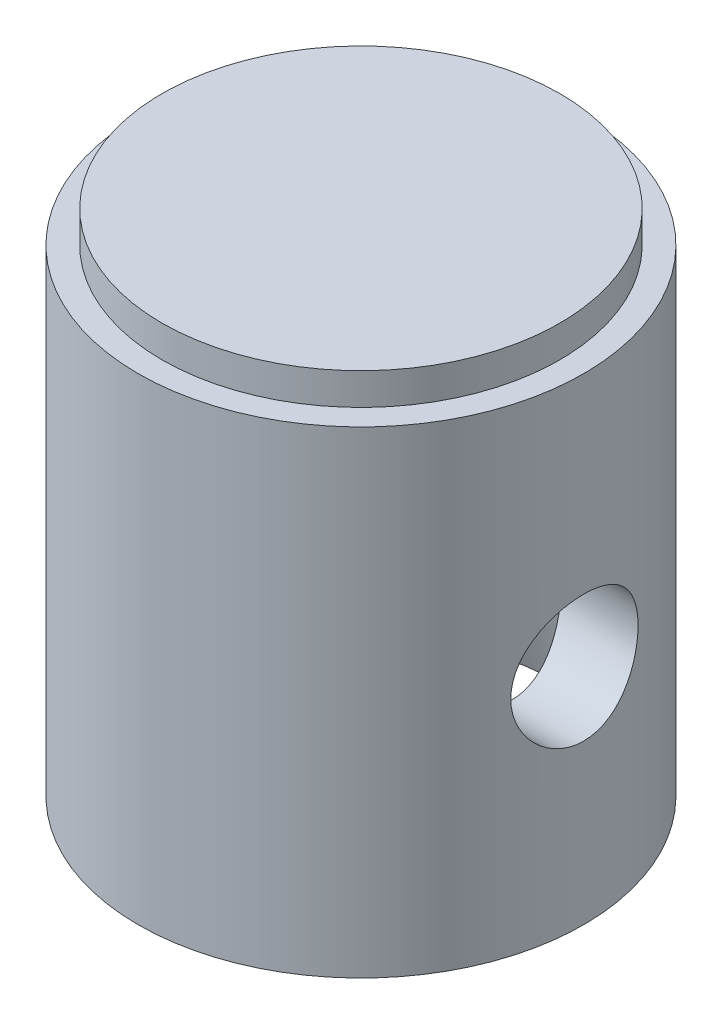
ISO-10303-21;
HEADER;
FILE_DESCRIPTION(('STEP AP214'),'2;1');
FILE_NAME('part.step','',(''),(''),'','','');
FILE_SCHEMA(('AUTOMOTIVE_DESIGN { 1 0 10303 214 1 1 1 1 }'));
ENDSEC;
DATA;
#1=APPLICATION_CONTEXT('core data for automotive mechanical design processes');
#2=APPLICATION_PROTOCOL_DEFINITION('international standard','automotive_design',2000,#1);
#3=PRODUCT_CONTEXT('',#1,'mechanical');
#4=PRODUCT('Part','Part','',(#3));
#5=PRODUCT_RELATED_PRODUCT_CATEGORY('part','',(#4));
#6=PRODUCT_DEFINITION_FORMATION('','',#4);
#7=PRODUCT_DEFINITION_CONTEXT('part definition',#1,'design');
#8=PRODUCT_DEFINITION('design','',#6,#7);
#9=PRODUCT_DEFINITION_SHAPE('','',#8);
#10=(LENGTH_UNIT() NAMED_UNIT(*) SI_UNIT(.MILLI.,.METRE.));
#11=(NAMED_UNIT(*) PLANE_ANGLE_UNIT() SI_UNIT($,.RADIAN.));
#12=(NAMED_UNIT(*) SI_UNIT($,.STERADIAN.) SOLID_ANGLE_UNIT());
#13=UNCERTAINTY_MEASURE_WITH_UNIT(LENGTH_MEASURE(1.E-05),#10,'distance_accuracy_value','');
#14=(GEOMETRIC_REPRESENTATION_CONTEXT(3) GLOBAL_UNCERTAINTY_ASSIGNED_CONTEXT((#13)) GLOBAL_UNIT_ASSIGNED_CONTEXT((#10,
#11,#12)) REPRESENTATION_CONTEXT('',''));
#15=CARTESIAN_POINT('',(0.,0.,0.));
#16=DIRECTION('',(0.,0.,1.));
#17=DIRECTION('',(1.,0.,0.));
#18=AXIS2_PLACEMENT_3D('',#15,#16,#17);
#19=CARTESIAN_POINT('',(6.25,9.55576170218685,0.));
#20=DIRECTION('',(0.,-1.,0.));
#21=DIRECTION('',(0.,0.,-1.));
#22=AXIS2_PLACEMENT_3D('',#19,#20,#21);
#23=PLANE('',#22);
#24=CARTESIAN_POINT('',(0.,9.55576170218685,0.));
#25=DIRECTION('',(0.,1.,0.));
#26=DIRECTION('',(0.,0.,1.));
#27=AXIS2_PLACEMENT_3D('',#24,#25,#26);
#28=CIRCLE('',#27,6.25);
#29=CARTESIAN_POINT('',(0.,9.55576170218685,6.25));
#30=VERTEX_POINT('',#29);
#31=EDGE_CURVE('E85',#30,#30,#28,.T.);
#32=ORIENTED_EDGE('',*,*,#31,.T.);
#33=EDGE_LOOP('',(#32));
#34=FACE_BOUND('',#33,.T.);
#35=ADVANCED_FACE('F41',(#34),#23,.F.);
#36=CARTESIAN_POINT('',(0.,7.40984964256775,0.));
#37=DIRECTION('',(0.,-1.,0.));
#38=DIRECTION('',(0.,0.,-1.));
#39=AXIS2_PLACEMENT_3D('',#36,#37,#38);
#40=CONICAL_SURFACE('',#39,0.,1.02974425867666);
#41=CARTESIAN_POINT('',(0.,4.55576170218685,0.));
#42=DIRECTION('',(0.,1.,0.));
#43=DIRECTION('',(0.,0.,1.));
#44=AXIS2_PLACEMENT_3D('',#41,#42,#43);
#45=CIRCLE('',#44,4.75);
#46=CARTESIAN_POINT('',(0.,4.55576170218685,4.75));
#47=VERTEX_POINT('',#46);
#48=EDGE_CURVE('E103',#47,#47,#45,.T.);
#49=ORIENTED_EDGE('',*,*,#48,.F.);
#50=EDGE_LOOP('',(#49));
#51=FACE_BOUND('',#50,.T.);
#52=CARTESIAN_POINT('',(0.,7.40984964256775,0.));
#53=VERTEX_POINT('',#52);
#54=VERTEX_LOOP('',#53);
#55=FACE_BOUND('',#54,.T.);
#56=ADVANCED_FACE('F55',(#51,#55),#40,.F.);
#57=CARTESIAN_POINT('',(0.,8.10891089108911,0.));
#58=DIRECTION('',(0.,1.,0.));
#59=DIRECTION('',(0.,0.,1.));
#60=AXIS2_PLACEMENT_3D('',#57,#58,#59);
#61=CYLINDRICAL_SURFACE('',#60,4.75);
#62=CARTESIAN_POINT('',(-4.30842198490352,0.555761702186853,-2.));
#63=CARTESIAN_POINT('',(-4.30843054464486,0.449194189419275,-1.99999131934848));
#64=CARTESIAN_POINT('',(-4.31243212963685,0.342471289222361,-1.99143079107255));
#65=CARTESIAN_POINT('',(-4.32792093407999,0.132105158718151,-1.9575309488105));
#66=CARTESIAN_POINT('',(-4.33942828076367,0.0284709946892458,-1.93214651737775));
#67=CARTESIAN_POINT('',(-4.36837651337227,-0.172281978748336,-1.86576551208753));
#68=CARTESIAN_POINT('',(-4.38579283230239,-0.269425802291525,-1.8248334955727));
#69=CARTESIAN_POINT('',(-4.42456063901514,-0.455440802484032,-1.72871004996954));
#70=CARTESIAN_POINT('',(-4.44591125359938,-0.54431380822792,-1.67352178389854));
#71=CARTESIAN_POINT('',(-4.49165970324772,-0.716966437794243,-1.5467015963202));
#72=CARTESIAN_POINT('',(-4.51616225633892,-0.80015692528574,-1.47430503116527));
#73=CARTESIAN_POINT('',(-4.56459392696584,-0.953652612186102,-1.31672831441459));
#74=CARTESIAN_POINT('',(-4.58852281750948,-1.02395278186696,-1.23154319627829));
#75=CARTESIAN_POINT('',(-4.63438842840327,-1.15269948454706,-1.04615829588292));
#76=CARTESIAN_POINT('',(-4.65618928890282,-1.21048009615943,-0.945459368167892));
#77=CARTESIAN_POINT('',(-4.69405721652876,-1.30802538390718,-0.734686551915895));
#78=CARTESIAN_POINT('',(-4.71012687932976,-1.34779821801796,-0.624616935439679));
#79=CARTESIAN_POINT('',(-4.73397861503267,-1.40605425558268,-0.404415522796753));
#80=CARTESIAN_POINT('',(-4.74215483370298,-1.42555419955888,-0.294596284647781));
#81=CARTESIAN_POINT('',(-4.75073207786679,-1.44599933609554,-0.0729606495985198));
#82=CARTESIAN_POINT('',(-4.75113632780298,-1.44695222348068,0.0388548997969275));
#83=CARTESIAN_POINT('',(-4.74435401811761,-1.43080228994989,0.25390450753408));
#84=CARTESIAN_POINT('',(-4.73763746002986,-1.41481746107326,0.357240149333749));
#85=CARTESIAN_POINT('',(-4.71801685316286,-1.36716635676943,0.559603082118503));
#86=CARTESIAN_POINT('',(-4.70511234778455,-1.33549892414149,0.658630054585297));
#87=CARTESIAN_POINT('',(-4.67411206487987,-1.257009360187,0.851387128927116));
#88=CARTESIAN_POINT('',(-4.65593996608066,-1.20996302454373,0.945013153905918));
#89=CARTESIAN_POINT('',(-4.61617592633721,-1.10227365607975,1.12328732884621));
#90=CARTESIAN_POINT('',(-4.59458276960119,-1.04162578628504,1.20793226914312));
#91=CARTESIAN_POINT('',(-4.54830782988722,-0.903395985404505,1.37229770971299));
#92=CARTESIAN_POINT('',(-4.52351560106454,-0.82491112100109,1.45122884715761));
#93=CARTESIAN_POINT('',(-4.47479248215149,-0.655774638638896,1.59515452572047));
#94=CARTESIAN_POINT('',(-4.45086194184458,-0.565118148938156,1.66014345921645));
#95=CARTESIAN_POINT('',(-4.40577320225433,-0.37030615172039,1.7764273686949));
#96=CARTESIAN_POINT('',(-4.38473764193727,-0.265795286896516,1.82717867740344));
#97=CARTESIAN_POINT('',(-4.34928865313087,-0.0485899285548528,1.91003748440372));
#98=CARTESIAN_POINT('',(-4.33487037464152,0.0640985010030139,1.94215864184886));
#99=CARTESIAN_POINT('',(-4.31549852286991,0.286544098545186,1.98481471902991));
#100=CARTESIAN_POINT('',(-4.30998424080262,0.396005681354565,1.9966317594255));
#101=CARTESIAN_POINT('',(-4.30744060160681,0.615463104487311,2.00211667986055));
#102=CARTESIAN_POINT('',(-4.31040820403393,0.725458739261143,1.99579106337395));
#103=CARTESIAN_POINT('',(-4.32391366279905,0.935209863626901,1.96634091191023));
#104=CARTESIAN_POINT('',(-4.33393906571426,1.03516212102973,1.9443524158464));
#105=CARTESIAN_POINT('',(-4.35977052749396,1.22987178862912,1.88571462232035));
#106=CARTESIAN_POINT('',(-4.37557795658566,1.32462796132941,1.84906184951785));
#107=CARTESIAN_POINT('',(-4.41201518341638,1.51078900054006,1.76039932389396));
#108=CARTESIAN_POINT('',(-4.43282235903574,1.60187706049728,1.70779965559225));
#109=CARTESIAN_POINT('',(-4.47666738500819,1.77437756660037,1.589319161925));
#110=CARTESIAN_POINT('',(-4.49970621283597,1.85578573781476,1.52343250299735));
#111=CARTESIAN_POINT('',(-4.54773889674336,2.01368986465641,1.37376869985395));
#112=CARTESIAN_POINT('',(-4.57273542348659,2.08920862217041,1.2889572905915));
#113=CARTESIAN_POINT('',(-4.62008723507347,2.22512424152227,1.10729218870919));
#114=CARTESIAN_POINT('',(-4.64244230114524,2.28551985128908,1.01043749999861));
#115=CARTESIAN_POINT('',(-4.682159175267,2.38945591835673,0.806650096429425));
#116=CARTESIAN_POINT('',(-4.69950379318315,2.43293852220715,0.6996843189877));
#117=CARTESIAN_POINT('',(-4.72708719511963,2.50096864666081,0.479036335100372));
#118=CARTESIAN_POINT('',(-4.73733030731735,2.52552770167856,0.365358265548636));
#119=CARTESIAN_POINT('',(-4.74904919006876,2.55353872779214,0.143237353681145));
#120=CARTESIAN_POINT('',(-4.75109668232659,2.55836761025123,0.0349971697480149));
#121=CARTESIAN_POINT('',(-4.74778566283005,2.55050063868136,-0.180716748799997));
#122=CARTESIAN_POINT('',(-4.74242849849833,2.53780797304267,-0.288190619283815));
#123=CARTESIAN_POINT('',(-4.72521382558719,2.49624679177646,-0.495239451900787));
#124=CARTESIAN_POINT('',(-4.71360275973926,2.46799067474204,-0.594959548485699));
#125=CARTESIAN_POINT('',(-4.68516673707061,2.3967803969835,-0.788200583199375));
#126=CARTESIAN_POINT('',(-4.66834080086551,2.35382347520078,-0.881720352860748));
#127=CARTESIAN_POINT('',(-4.63014910919753,2.25225550678784,-1.064584614925));
#128=CARTESIAN_POINT('',(-4.6086119906344,2.19302255272573,-1.15354705854381));
#129=CARTESIAN_POINT('',(-4.56353829444643,2.0614836466712,-1.32065163159127));
#130=CARTESIAN_POINT('',(-4.54000095769205,1.98917271942986,-1.3987896230298));
#131=CARTESIAN_POINT('',(-4.49151263650841,1.82757953779019,-1.54769821595443));
#132=CARTESIAN_POINT('',(-4.46657752434327,1.73746546466663,-1.61757515170057));
#133=CARTESIAN_POINT('',(-4.41979333465504,1.546058640499,-1.74135517953708));
#134=CARTESIAN_POINT('',(-4.39794600935449,1.44475959994569,-1.79524922073293));
#135=CARTESIAN_POINT('',(-4.36022694521342,1.23379740033437,-1.88502336126085));
#136=CARTESIAN_POINT('',(-4.3443308421422,1.12417060456636,-1.92097711385374));
#137=CARTESIAN_POINT('',(-4.32660944209334,0.955991056566383,-1.9603932149606));
#138=CARTESIAN_POINT('',(-4.32172453578694,0.899364325330725,-1.9711094684443));
#139=CARTESIAN_POINT('',(-4.31415686352989,0.785262529818344,-1.98762169826053));
#140=CARTESIAN_POINT('',(-4.31147257065106,0.727788081978567,-1.99342108632849));
#141=CARTESIAN_POINT('',(-4.30892809699833,0.632080006528274,-1.99890914769187));
#142=CARTESIAN_POINT('',(-4.30841891907438,0.593930821266735,-2.00000310913535));
#143=CARTESIAN_POINT('',(-4.30842198490352,0.555761702186853,-2.));
#144=B_SPLINE_CURVE_WITH_KNOTS('',3,(#62,#63,#64,#65,#66,#67,#68,#69,#70,#71,#72,#73,#74,#75,
#76,#77,#78,#79,#80,#81,#82,#83,#84,#85,#86,#87,#88,#89,#90,#91,#92,#93,#94,#95,#96,#97,#98,#99,
#100,#101,#102,#103,#104,#105,#106,#107,#108,#109,#110,#111,#112,#113,#114,#115,#116,#117,#118,
#119,#120,#121,#122,#123,#124,#125,#126,#127,#128,#129,#130,#131,#132,#133,#134,#135,#136,#137,
#138,#139,#140,#141,#142,#143),.UNSPECIFIED.,.T.,.F.,(4,2,2,2,2,2,2,2,2,2,2,2,2,2,2,2,2,2,2,2,2,
2,2,2,2,2,2,2,2,2,2,2,2,2,2,2,2,2,2,2,4),(0.,0.3195673434676,0.639995172162606,
0.959106799139382,1.27814768591402,1.61558401305247,1.95315172701683,2.30572671230962,
2.65814181207011,2.99187659997614,3.32547292464746,3.63834534304787,3.95124085137407,
4.26891815696387,4.58670861451657,4.92730569009794,5.26803949971278,5.62041363560371,
5.97252909208191,6.30145873189971,6.63027047730072,6.9373851990156,7.24457274812027,
7.56490236261953,7.88537292302805,8.23259290369929,8.57984162180395,8.92826792359706,
9.27648168177332,9.59993054486148,9.92332055782565,10.2348109826313,10.5463599427188,
10.8720466326587,11.1978574851006,11.5463872959705,11.8951140992724,12.2423971882221,
12.4157051509404,12.5888927593436,12.703351694061),.UNSPECIFIED.);
#145=CARTESIAN_POINT('',(-4.30842198490352,0.555761702186853,-2.));
#146=VERTEX_POINT('',#145);
#147=EDGE_CURVE('E79',#146,#146,#144,.T.);
#148=ORIENTED_EDGE('',*,*,#147,.T.);
#149=EDGE_LOOP('',(#148));
#150=FACE_BOUND('',#149,.T.);
#151=CARTESIAN_POINT('',(4.30842198490352,0.555761702186853,-2.));
#152=CARTESIAN_POINT('',(4.30843054464486,0.662329214954431,-1.99999131934848));
#153=CARTESIAN_POINT('',(4.31243212963685,0.769052115151345,-1.99143079107255));
#154=CARTESIAN_POINT('',(4.32792093407999,0.979418245655555,-1.9575309488105));
#155=CARTESIAN_POINT('',(4.33942828076367,1.08305240968446,-1.93214651737775));
#156=CARTESIAN_POINT('',(4.36837651337227,1.28380538312204,-1.86576551208753));
#157=CARTESIAN_POINT('',(4.38579283230239,1.38094920666523,-1.8248334955727));
#158=CARTESIAN_POINT('',(4.42456063901514,1.56696420685774,-1.72871004996954));
#159=CARTESIAN_POINT('',(4.44591125359938,1.65583721260163,-1.67352178389854));
#160=CARTESIAN_POINT('',(4.49165970324772,1.82848984216795,-1.5467015963202));
#161=CARTESIAN_POINT('',(4.51616225633892,1.91168032965945,-1.47430503116527));
#162=CARTESIAN_POINT('',(4.56459392696584,2.06517601655981,-1.31672831441459));
#163=CARTESIAN_POINT('',(4.58852281750948,2.13547618624067,-1.23154319627829));
#164=CARTESIAN_POINT('',(4.63438842840327,2.26422288892077,-1.04615829588292));
#165=CARTESIAN_POINT('',(4.65618928890282,2.32200350053314,-0.945459368167892));
#166=CARTESIAN_POINT('',(4.69405721652876,2.41954878828088,-0.734686551915895));
#167=CARTESIAN_POINT('',(4.71012687932976,2.45932162239166,-0.624616935439679));
#168=CARTESIAN_POINT('',(4.73397861503267,2.51757765995639,-0.404415522796753));
#169=CARTESIAN_POINT('',(4.74215483370298,2.53707760393259,-0.294596284647781));
#170=CARTESIAN_POINT('',(4.75073207786679,2.55752274046924,-0.0729606495985197));
#171=CARTESIAN_POINT('',(4.75113632780298,2.55847562785439,0.0388548997969277));
#172=CARTESIAN_POINT('',(4.74435401811761,2.5423256943236,0.25390450753408));
#173=CARTESIAN_POINT('',(4.73763746002986,2.52634086544696,0.35724014933375));
#174=CARTESIAN_POINT('',(4.71801685316286,2.47868976114314,0.559603082118503));
#175=CARTESIAN_POINT('',(4.70511234778455,2.4470223285152,0.658630054585297));
#176=CARTESIAN_POINT('',(4.67411206487987,2.3685327645607,0.851387128927116));
#177=CARTESIAN_POINT('',(4.65593996608066,2.32148642891744,0.945013153905918));
#178=CARTESIAN_POINT('',(4.61617592633721,2.21379706045346,1.12328732884621));
#179=CARTESIAN_POINT('',(4.59458276960119,2.15314919065875,1.20793226914312));
#180=CARTESIAN_POINT('',(4.54830782988722,2.01491938977821,1.37229770971299));
#181=CARTESIAN_POINT('',(4.52351560106454,1.9364345253748,1.45122884715761));
#182=CARTESIAN_POINT('',(4.47479248215149,1.7672980430126,1.59515452572048));
#183=CARTESIAN_POINT('',(4.45086194184458,1.67664155331186,1.66014345921645));
#184=CARTESIAN_POINT('',(4.40577320225433,1.4818295560941,1.7764273686949));
#185=CARTESIAN_POINT('',(4.38473764193727,1.37731869127022,1.82717867740344));
#186=CARTESIAN_POINT('',(4.34928865313087,1.16011333292856,1.91003748440372));
#187=CARTESIAN_POINT('',(4.33487037464151,1.04742490337069,1.94215864184886));
#188=CARTESIAN_POINT('',(4.31549852286991,0.82497930582852,1.98481471902991));
#189=CARTESIAN_POINT('',(4.30998424080262,0.715517723019141,1.9966317594255));
#190=CARTESIAN_POINT('',(4.30744060160681,0.496060299886394,2.00211667986055));
#191=CARTESIAN_POINT('',(4.31040820403393,0.386064665112562,1.99579106337395));
#192=CARTESIAN_POINT('',(4.32391366279905,0.176313540746805,1.96634091191023));
#193=CARTESIAN_POINT('',(4.33393906571426,0.0763612833439732,1.9443524158464));
#194=CARTESIAN_POINT('',(4.35977052749396,-0.118348384255419,1.88571462232035));
#195=CARTESIAN_POINT('',(4.37557795658566,-0.213104556955705,1.84906184951785));
#196=CARTESIAN_POINT('',(4.41201518341638,-0.399265596166358,1.76039932389396));
#197=CARTESIAN_POINT('',(4.43282235903574,-0.49035365612357,1.70779965559225));
#198=CARTESIAN_POINT('',(4.47666738500819,-0.662854162226665,1.589319161925));
#199=CARTESIAN_POINT('',(4.49970621283597,-0.744262333441057,1.52343250299735));
#200=CARTESIAN_POINT('',(4.54773889674336,-0.902166460282703,1.37376869985395));
#201=CARTESIAN_POINT('',(4.57273542348659,-0.977685217796702,1.2889572905915));
#202=CARTESIAN_POINT('',(4.62008723507347,-1.11360083714857,1.10729218870919));
#203=CARTESIAN_POINT('',(4.64244230114524,-1.17399644691538,1.01043749999861));
#204=CARTESIAN_POINT('',(4.682159175267,-1.27793251398302,0.806650096429425));
#205=CARTESIAN_POINT('',(4.69950379318315,-1.32141511783345,0.699684318987699));
#206=CARTESIAN_POINT('',(4.72708719511963,-1.3894452422871,0.479036335100372));
#207=CARTESIAN_POINT('',(4.73733030731735,-1.41400429730485,0.365358265548636));
#208=CARTESIAN_POINT('',(4.74904919006876,-1.44201532341844,0.143237353681144));
#209=CARTESIAN_POINT('',(4.75109668232659,-1.44684420587753,0.0349971697480141));
#210=CARTESIAN_POINT('',(4.74778566283005,-1.43897723430765,-0.180716748799998));
#211=CARTESIAN_POINT('',(4.74242849849833,-1.42628456866896,-0.288190619283816));
#212=CARTESIAN_POINT('',(4.72521382558719,-1.38472338740275,-0.495239451900788));
#213=CARTESIAN_POINT('',(4.71360275973926,-1.35646727036833,-0.5949595484857));
#214=CARTESIAN_POINT('',(4.68516673707061,-1.28525699260979,-0.788200583199376));
#215=CARTESIAN_POINT('',(4.66834080086551,-1.24230007082708,-0.881720352860749));
#216=CARTESIAN_POINT('',(4.63014910919753,-1.14073210241413,-1.064584614925));
#217=CARTESIAN_POINT('',(4.6086119906344,-1.08149914835203,-1.15354705854381));
#218=CARTESIAN_POINT('',(4.56353829444643,-0.949960242297496,-1.32065163159127));
#219=CARTESIAN_POINT('',(4.54000095769205,-0.877649315056154,-1.3987896230298));
#220=CARTESIAN_POINT('',(4.49151263650841,-0.716056133416485,-1.54769821595443));
#221=CARTESIAN_POINT('',(4.46657752434327,-0.625942060292924,-1.61757515170057));
#222=CARTESIAN_POINT('',(4.41979333465504,-0.434535236125293,-1.74135517953708));
#223=CARTESIAN_POINT('',(4.39794600935449,-0.333236195571981,-1.79524922073293));
#224=CARTESIAN_POINT('',(4.36022694521342,-0.122273995960661,-1.88502336126085));
#225=CARTESIAN_POINT('',(4.3443308421422,-0.0126472001926526,-1.92097711385374));
#226=CARTESIAN_POINT('',(4.32660944209334,0.155532347807326,-1.9603932149606));
#227=CARTESIAN_POINT('',(4.32172453578694,0.212159079042984,-1.9711094684443));
#228=CARTESIAN_POINT('',(4.31415686352989,0.326260874555364,-1.98762169826053));
#229=CARTESIAN_POINT('',(4.31147257065106,0.383735322395142,-1.99342108632849));
#230=CARTESIAN_POINT('',(4.30892809699833,0.479443397845433,-1.99890914769187));
#231=CARTESIAN_POINT('',(4.30841891907438,0.517592583106971,-2.00000310913535));
#232=CARTESIAN_POINT('',(4.30842198490352,0.555761702186853,-2.));
#233=B_SPLINE_CURVE_WITH_KNOTS('',3,(#151,#152,#153,#154,#155,#156,#157,#158,#159,#160,#161,
#162,#163,#164,#165,#166,#167,#168,#169,#170,#171,#172,#173,#174,#175,#176,#177,#178,#179,#180,
#181,#182,#183,#184,#185,#186,#187,#188,#189,#190,#191,#192,#193,#194,#195,#196,#197,#198,#199,
#200,#201,#202,#203,#204,#205,#206,#207,#208,#209,#210,#211,#212,#213,#214,#215,#216,#217,#218,
#219,#220,#221,#222,#223,#224,#225,#226,#227,#228,#229,#230,#231,#232),.UNSPECIFIED.,.T.,.F.,(4,
2,2,2,2,2,2,2,2,2,2,2,2,2,2,2,2,2,2,2,2,2,2,2,2,2,2,2,2,2,2,2,2,2,2,2,2,2,2,2,4),(0.,
0.3195673434676,0.639995172162606,0.959106799139383,1.27814768591402,1.61558401305247,
1.95315172701683,2.30572671230962,2.65814181207011,2.99187659997614,3.32547292464746,
3.63834534304787,3.95124085137407,4.26891815696387,4.58670861451657,4.92730569009794,
5.26803949971278,5.62041363560371,5.97252909208191,6.30145873189971,6.63027047730072,
6.9373851990156,7.24457274812027,7.56490236261953,7.88537292302805,8.23259290369929,
8.57984162180395,8.92826792359706,9.27648168177332,9.59993054486148,9.92332055782565,
10.2348109826313,10.5463599427188,10.8720466326587,11.1978574851006,11.5463872959705,
11.8951140992724,12.2423971882221,12.4157051509404,12.5888927593436,12.703351694061),.UNSPECIFIED.);
#234=CARTESIAN_POINT('',(4.30842198490352,0.555761702186853,-2.));
#235=VERTEX_POINT('',#234);
#236=EDGE_CURVE('E74',#235,#235,#233,.T.);
#237=ORIENTED_EDGE('',*,*,#236,.T.);
#238=EDGE_LOOP('',(#237));
#239=FACE_BOUND('',#238,.T.);
#240=CARTESIAN_POINT('',(0.,-2.46039603960396,0.));
#241=DIRECTION('',(0.,1.,0.));
#242=DIRECTION('',(0.,0.,1.));
#243=AXIS2_PLACEMENT_3D('',#240,#241,#242);
#244=CIRCLE('',#243,4.75);
#245=CARTESIAN_POINT('',(0.,-2.46039603960396,4.75));
#246=VERTEX_POINT('',#245);
#247=EDGE_CURVE('E125',#246,#246,#244,.T.);
#248=ORIENTED_EDGE('',*,*,#247,.F.);
#249=EDGE_LOOP('',(#248));
#250=FACE_BOUND('',#249,.T.);
#251=ORIENTED_EDGE('',*,*,#48,.T.);
#252=EDGE_LOOP('',(#251));
#253=FACE_BOUND('',#252,.T.);
#254=ADVANCED_FACE('F57',(#150,#239,#250,#253),#61,.F.);
#255=CARTESIAN_POINT('',(0.,-2.46039603960396,0.));
#256=DIRECTION('',(0.,-1.,0.));
#257=DIRECTION('',(0.,0.,-1.));
#258=AXIS2_PLACEMENT_3D('',#255,#256,#257);
#259=CONICAL_SURFACE('',#258,4.75,0.349065850398868);
#260=CARTESIAN_POINT('',(0.,-6.44423829781315,0.));
#261=DIRECTION('',(0.,1.,0.));
#262=DIRECTION('',(0.,0.,1.));
#263=AXIS2_PLACEMENT_3D('',#260,#261,#262);
#264=CIRCLE('',#263,6.2);
#265=CARTESIAN_POINT('',(0.,-6.44423829781315,6.2));
#266=VERTEX_POINT('',#265);
#267=EDGE_CURVE('E124',#266,#266,#264,.T.);
#268=ORIENTED_EDGE('',*,*,#267,.F.);
#269=EDGE_LOOP('',(#268));
#270=FACE_BOUND('',#269,.T.);
#271=ORIENTED_EDGE('',*,*,#247,.T.);
#272=EDGE_LOOP('',(#271));
#273=FACE_BOUND('',#272,.T.);
#274=ADVANCED_FACE('F64',(#270,#273),#259,.F.);
#275=CARTESIAN_POINT('',(6.2,-6.44423829781315,0.));
#276=DIRECTION('',(0.,1.,0.));
#277=DIRECTION('',(0.,0.,1.));
#278=AXIS2_PLACEMENT_3D('',#275,#276,#277);
#279=PLANE('',#278);
#280=CARTESIAN_POINT('',(0.,-6.44423829781315,0.));
#281=DIRECTION('',(0.,1.,0.));
#282=DIRECTION('',(0.,0.,1.));
#283=AXIS2_PLACEMENT_3D('',#280,#281,#282);
#284=CIRCLE('',#283,7.);
#285=CARTESIAN_POINT('',(0.,-6.44423829781315,7.));
#286=VERTEX_POINT('',#285);
#287=EDGE_CURVE('E121',#286,#286,#284,.T.);
#288=ORIENTED_EDGE('',*,*,#287,.F.);
#289=EDGE_LOOP('',(#288));
#290=FACE_BOUND('',#289,.T.);
#291=ORIENTED_EDGE('',*,*,#267,.T.);
#292=EDGE_LOOP('',(#291));
#293=FACE_BOUND('',#292,.T.);
#294=ADVANCED_FACE('F109',(#290,#293),#279,.F.);
#295=CARTESIAN_POINT('',(0.,8.10891089108911,0.));
#296=DIRECTION('',(0.,1.,0.));
#297=DIRECTION('',(0.,0.,1.));
#298=AXIS2_PLACEMENT_3D('',#295,#296,#297);
#299=CYLINDRICAL_SURFACE('',#298,7.);
#300=CARTESIAN_POINT('',(-7.,2.55576170218685,0.));
#301=CARTESIAN_POINT('',(-6.99999869294341,2.55575976262491,0.109954902377251));
#302=CARTESIAN_POINT('',(-6.99738417402043,2.54666391321074,0.219929747872581));
#303=CARTESIAN_POINT('',(-6.98720905945103,2.51059743208454,0.436691991196988));
#304=CARTESIAN_POINT('',(-6.97964659210084,2.48362003611276,0.543478166829615));
#305=CARTESIAN_POINT('',(-6.96040691349073,2.41275366377035,0.75070430073787));
#306=CARTESIAN_POINT('',(-6.94873544106341,2.36888826603491,0.851152880848224));
#307=CARTESIAN_POINT('',(-6.92249978316544,2.2655837107085,1.04326876112927));
#308=CARTESIAN_POINT('',(-6.90793529508023,2.2061429236965,1.13493514117816));
#309=CARTESIAN_POINT('',(-6.8770473462558,2.07172669151394,1.30929444685894));
#310=CARTESIAN_POINT('',(-6.86069041945191,1.99641694833158,1.39172372238094));
#311=CARTESIAN_POINT('',(-6.82826734915641,1.83311395904917,1.54297135792435));
#312=CARTESIAN_POINT('',(-6.81220124959344,1.74511881455462,1.61178767707782));
#313=CARTESIAN_POINT('',(-6.78183014875388,1.55676811939594,1.7351979000643));
#314=CARTESIAN_POINT('',(-6.76756702506018,1.45619971712199,1.78947821103348));
#315=CARTESIAN_POINT('',(-6.74291343840667,1.24688969043609,1.8802517055398));
#316=CARTESIAN_POINT('',(-6.73252214244871,1.13814983011596,1.91674871555719));
#317=CARTESIAN_POINT('',(-6.71713608196017,0.918526939021315,1.96998433013875));
#318=CARTESIAN_POINT('',(-6.71200978570012,0.807770339419018,1.9872055320285));
#319=CARTESIAN_POINT('',(-6.70734208201995,0.584830553740753,2.00290667789184));
#320=CARTESIAN_POINT('',(-6.70779946107612,0.472647682936632,2.00139069409621));
#321=CARTESIAN_POINT('',(-6.71413034409934,0.253893090730693,1.98004134762903));
#322=CARTESIAN_POINT('',(-6.71982782697936,0.147257351006096,1.96080325728391));
#323=CARTESIAN_POINT('',(-6.73571348382811,-0.0612055174407413,1.90551386085789));
#324=CARTESIAN_POINT('',(-6.74590206376404,-0.163032210533648,1.8694610348125));
#325=CARTESIAN_POINT('',(-6.7697686351608,-0.36048454224496,1.78110681137812));
#326=CARTESIAN_POINT('',(-6.78348916405649,-0.456015370214819,1.72860551172881));
#327=CARTESIAN_POINT('',(-6.81285216882059,-0.637114859026553,1.60898379167885));
#328=CARTESIAN_POINT('',(-6.82849507221913,-0.722681295548059,1.54186011673345));
#329=CARTESIAN_POINT('',(-6.86066250656356,-0.884810673419514,1.39190399673021));
#330=CARTESIAN_POINT('',(-6.87719804572366,-0.960912773780376,1.30857487484533));
#331=CARTESIAN_POINT('',(-6.90876247218345,-1.09816430145343,1.13013228238623));
#332=CARTESIAN_POINT('',(-6.92379128137826,-1.15931295385486,1.03501820148189));
#333=CARTESIAN_POINT('',(-6.95076528065502,-1.26516703258718,0.834923073091445));
#334=CARTESIAN_POINT('',(-6.96269275497229,-1.30977858461733,0.729889817810005));
#335=CARTESIAN_POINT('',(-6.98199251487585,-1.38057218922997,0.513393229967469));
#336=CARTESIAN_POINT('',(-6.98936594856256,-1.40675888705842,0.401931525810146));
#337=CARTESIAN_POINT('',(-6.99854874514672,-1.4392115835226,0.17966638864435));
#338=CARTESIAN_POINT('',(-7.00053272850599,-1.44610299318617,0.068961346860508));
#339=CARTESIAN_POINT('',(-6.99922084707091,-1.44151103151211,-0.152026526805583));
#340=CARTESIAN_POINT('',(-6.99592561580629,-1.43002986496723,-0.262309407757108));
#341=CARTESIAN_POINT('',(-6.98453926685206,-1.38952785349689,-0.477018633430315));
#342=CARTESIAN_POINT('',(-6.97654613017679,-1.36086511648975,-0.581518211734843));
#343=CARTESIAN_POINT('',(-6.95667998741884,-1.28723779582847,-0.78420868620564));
#344=CARTESIAN_POINT('',(-6.94480653265874,-1.24227132692381,-0.882398851248717));
#345=CARTESIAN_POINT('',(-6.91809961169145,-1.13621496116802,-1.07204168512003));
#346=CARTESIAN_POINT('',(-6.9032076317834,-1.07479709898782,-1.16330248654009));
#347=CARTESIAN_POINT('',(-6.87217947098441,-0.937985791862051,-1.33443852805947));
#348=CARTESIAN_POINT('',(-6.85604300755108,-0.862589167748578,-1.41431117084304));
#349=CARTESIAN_POINT('',(-6.82368619629444,-0.697028955763709,-1.56310642834007));
#350=CARTESIAN_POINT('',(-6.80748036858305,-0.606463022254102,-1.63158542740713));
#351=CARTESIAN_POINT('',(-6.77738894734787,-0.414775709188479,-1.75239531606757));
#352=CARTESIAN_POINT('',(-6.76350327310609,-0.313654697041885,-1.8047267674867));
#353=CARTESIAN_POINT('',(-6.73978651242836,-0.104147086837933,-1.89137454118278));
#354=CARTESIAN_POINT('',(-6.72993400029434,0.004197465684467,-1.92578633239654));
#355=CARTESIAN_POINT('',(-6.71542456669526,0.225471637761643,-1.9757945006787));
#356=CARTESIAN_POINT('',(-6.71076607094367,0.338399857263262,-1.99139657901587));
#357=CARTESIAN_POINT('',(-6.70731703127619,0.56105773512363,-2.00298024246851));
#358=CARTESIAN_POINT('',(-6.70831160808103,0.670747206743514,-1.99968027644405));
#359=CARTESIAN_POINT('',(-6.71554597206102,0.887936432848546,-1.97524710957466));
#360=CARTESIAN_POINT('',(-6.72178558421114,0.995436260278769,-1.95411450379873));
#361=CARTESIAN_POINT('',(-6.73866977160528,1.20414007335545,-1.89505968816675));
#362=CARTESIAN_POINT('',(-6.74926877048974,1.30539708919802,-1.85731091786365));
#363=CARTESIAN_POINT('',(-6.77367302842112,1.50022043667905,-1.76622949301581));
#364=CARTESIAN_POINT('',(-6.78747885482392,1.59378540346008,-1.71289408043152));
#365=CARTESIAN_POINT('',(-6.81731668949935,1.77394522399218,-1.59006546534828));
#366=CARTESIAN_POINT('',(-6.83340763179064,1.86020309352881,-1.52009227722732));
#367=CARTESIAN_POINT('',(-6.86569845092232,2.01998559799667,-1.36685984037935));
#368=CARTESIAN_POINT('',(-6.88189835417168,2.09350702129765,-1.28359725072856));
#369=CARTESIAN_POINT('',(-6.91307959572365,2.22759888651348,-1.10357432086539));
#370=CARTESIAN_POINT('',(-6.92801901037413,2.28778868945648,-1.00652250235978));
#371=CARTESIAN_POINT('',(-6.95451395777971,2.39090748720886,-0.803250529646661));
#372=CARTESIAN_POINT('',(-6.96607133870287,2.43384591411992,-0.697035424114739));
#373=CARTESIAN_POINT('',(-6.98327344725308,2.4966092535823,-0.492916315335035));
#374=CARTESIAN_POINT('',(-6.98949684362077,2.51873523887141,-0.395763007624391));
#375=CARTESIAN_POINT('',(-6.99786043852148,2.548311359429,-0.199078368786368));
#376=CARTESIAN_POINT('',(-7.00000118333996,2.55576345816374,-0.099547357616092));
#377=CARTESIAN_POINT('',(-7.,2.55576170218685,0.));
#378=B_SPLINE_CURVE_WITH_KNOTS('',3,(#300,#301,#302,#303,#304,#305,#306,#307,#308,#309,#310,
#311,#312,#313,#314,#315,#316,#317,#318,#319,#320,#321,#322,#323,#324,#325,#326,#327,#328,#329,
#330,#331,#332,#333,#334,#335,#336,#337,#338,#339,#340,#341,#342,#343,#344,#345,#346,#347,#348,
#349,#350,#351,#352,#353,#354,#355,#356,#357,#358,#359,#360,#361,#362,#363,#364,#365,#366,#367,
#368,#369,#370,#371,#372,#373,#374,#375,#376,#377),.UNSPECIFIED.,.T.,.F.,(4,2,2,2,2,2,2,2,2,2,2,
2,2,2,2,2,2,2,2,2,2,2,2,2,2,2,2,2,2,2,2,2,2,2,2,2,2,2,4),(0.,0.329499312542344,0.65912333979518,
0.988288812895343,1.31748873543516,1.65447811530781,1.99151797873713,2.33533075300057,
2.67906951544809,3.0139950986275,3.34884789231233,3.67284785829333,3.99687711786126,
4.3250080329121,4.65321205577343,4.99378500602501,5.33437560155449,5.67687101104448,
6.01928004014612,6.350454576982,6.68158937434648,7.00605140479519,7.33055096575529,
7.66207525344451,7.99367503187788,8.33612104884334,8.67855514965298,9.01914573366139,
9.35963305787734,9.68726681616472,10.0148896418598,10.3391709629126,10.6635096999758,
10.9986765689036,11.3339278310847,11.6777797897016,12.0214434923409,12.3197946803794,
12.6181059442772),.UNSPECIFIED.);
#379=CARTESIAN_POINT('',(-7.,2.55576170218685,0.));
#380=VERTEX_POINT('',#379);
#381=EDGE_CURVE('E11',#380,#380,#378,.T.);
#382=ORIENTED_EDGE('',*,*,#381,.T.);
#383=EDGE_LOOP('',(#382));
#384=FACE_BOUND('',#383,.T.);
#385=CARTESIAN_POINT('',(6.70820393249937,0.555761702186853,-2.));
#386=CARTESIAN_POINT('',(6.70820547009708,0.445910164309612,-1.99999802046393));
#387=CARTESIAN_POINT('',(6.71093179679208,0.336038617932343,-1.9909186659955));
#388=CARTESIAN_POINT('',(6.72150389207102,0.119490463323878,-1.95492363390195));
#389=CARTESIAN_POINT('',(6.72935174296489,0.0128151730862282,-1.92800070136334));
#390=CARTESIAN_POINT('',(6.74920709521546,-0.194175498684646,-1.85729343292866));
#391=CARTESIAN_POINT('',(6.76120815257369,-0.294500449630285,-1.81353520651874));
#392=CARTESIAN_POINT('',(6.78800921096146,-0.486406109367516,-1.71048364062938));
#393=CARTESIAN_POINT('',(6.80280954425194,-0.577985778191181,-1.65118845666347));
#394=CARTESIAN_POINT('',(6.83401783214155,-0.752429863127981,-1.51692480098199));
#395=CARTESIAN_POINT('',(6.8504575596415,-0.835006099942363,-1.4415892111325));
#396=CARTESIAN_POINT('',(6.88281965512018,-0.986541081116939,-1.27817124546927));
#397=CARTESIAN_POINT('',(6.89874196233652,-1.05549823093599,-1.19008737915963));
#398=CARTESIAN_POINT('',(6.92863332001513,-1.17906694616666,-1.00164603215759));
#399=CARTESIAN_POINT('',(6.94256054500867,-1.23338791756413,-0.901090783761868));
#400=CARTESIAN_POINT('',(6.96652540485531,-1.32424007222912,-0.69180847523964));
#401=CARTESIAN_POINT('',(6.97656379690866,-1.36077471905341,-0.583083010875173));
#402=CARTESIAN_POINT('',(6.99139519300236,-1.41407275905286,-0.363558575121178));
#403=CARTESIAN_POINT('',(6.99631827011303,-1.43132731951782,-0.252887798129041));
#404=CARTESIAN_POINT('',(7.00082095659694,-1.44712503169638,-0.0301201024219242));
#405=CARTESIAN_POINT('',(7.00040158738983,-1.4456717601505,0.081976539588548));
#406=CARTESIAN_POINT('',(6.99436006763307,-1.42443192289512,0.30098019573522));
#407=CARTESIAN_POINT('',(6.98888870776051,-1.40517668517516,0.407943546108945));
#408=CARTESIAN_POINT('',(6.97353886330137,-1.34974319534877,0.617052222177617));
#409=CARTESIAN_POINT('',(6.96366011056225,-1.31356391355103,0.719197254300509));
#410=CARTESIAN_POINT('',(6.94039031772111,-1.22492889700133,0.917073833728923));
#411=CARTESIAN_POINT('',(6.92696205512134,-1.17229952000482,1.01272304385077));
#412=CARTESIAN_POINT('',(6.89802768974041,-1.05239371141512,1.19400724359048));
#413=CARTESIAN_POINT('',(6.88252113191951,-0.985114070146669,1.27964003241601));
#414=CARTESIAN_POINT('',(6.85045683019623,-0.835032587194559,1.44163264854775));
#415=CARTESIAN_POINT('',(6.83388129369387,-0.7517688642081,1.51756157758489));
#416=CARTESIAN_POINT('',(6.80202973786992,-0.573523205967189,1.65449301574976));
#417=CARTESIAN_POINT('',(6.78675382405366,-0.478540320864144,1.71549431378261));
#418=CARTESIAN_POINT('',(6.7591517481441,-0.278507413315158,1.82123335985447));
#419=CARTESIAN_POINT('',(6.74685010938643,-0.173383072761489,1.86583737788771));
#420=CARTESIAN_POINT('',(6.72688544387342,0.0433148656914716,1.9365895149609));
#421=CARTESIAN_POINT('',(6.71922106753542,0.154886576846768,1.9627430040271));
#422=CARTESIAN_POINT('',(6.70969115196194,0.377242126519167,1.99507417199885));
#423=CARTESIAN_POINT('',(6.70763711316669,0.48792351911987,2.00190148157354));
#424=CARTESIAN_POINT('',(6.7090415959684,0.708850018107818,1.99718996719665));
#425=CARTESIAN_POINT('',(6.71249942992569,0.819095177197777,1.98565343424642));
#426=CARTESIAN_POINT('',(6.72435430053723,1.03340293020981,1.94511781425928));
#427=CARTESIAN_POINT('',(6.73263642965452,1.13754928820201,1.9165246218414));
#428=CARTESIAN_POINT('',(6.75309063930731,1.33956357418459,1.84315161866429));
#429=CARTESIAN_POINT('',(6.7652632811114,1.4374305938325,1.79836947226768));
#430=CARTESIAN_POINT('',(6.7925018800939,1.6267837774036,1.69261965121623));
#431=CARTESIAN_POINT('',(6.80763197381122,1.71805214638905,1.63127891729131));
#432=CARTESIAN_POINT('',(6.83893726549832,1.88923807563021,1.49460463684841));
#433=CARTESIAN_POINT('',(6.85511268947612,1.96915316919899,1.41926805768137));
#434=CARTESIAN_POINT('',(6.88734727436087,2.11814112047504,1.25370800996556));
#435=CARTESIAN_POINT('',(6.90338406046143,2.18675667360559,1.16306771024055));
#436=CARTESIAN_POINT('',(6.93297977045999,2.30780738356958,0.971185307057545));
#437=CARTESIAN_POINT('',(6.94653882385413,2.36024338610923,0.869943758098183));
#438=CARTESIAN_POINT('',(6.96956504846406,2.44694598921318,0.660433272956165));
#439=CARTESIAN_POINT('',(6.97906308127248,2.48135009177301,0.552224799899635));
#440=CARTESIAN_POINT('',(6.99303339623885,2.53138850412703,0.331245648549923));
#441=CARTESIAN_POINT('',(6.99750697123019,2.54702764236817,0.218476151585437));
#442=CARTESIAN_POINT('',(7.00085335003284,2.55875313618464,-0.00417823795903044));
#443=CARTESIAN_POINT('',(6.99991703588996,2.55550585126967,-0.114025631049958));
#444=CARTESIAN_POINT('',(6.99299069122135,2.53112342077656,-0.331545172422005));
#445=CARTESIAN_POINT('',(6.98700090270593,2.50998913180481,-0.439217424617532));
#446=CARTESIAN_POINT('',(6.97068801860116,2.450830341208,-0.648404133039588));
#447=CARTESIAN_POINT('',(6.96040414048174,2.41295852324288,-0.749965033435051));
#448=CARTESIAN_POINT('',(6.93657094143453,2.32153554390137,-0.945347202761463));
#449=CARTESIAN_POINT('',(6.92302111501785,2.2679819550946,-1.03916727058068));
#450=CARTESIAN_POINT('',(6.89358955440188,2.14486436476204,-1.21943345635391));
#451=CARTESIAN_POINT('',(6.8776504578623,2.07487161539844,-1.30557732800707));
#452=CARTESIAN_POINT('',(6.8454406498653,1.92165257673291,-1.46512122231839));
#453=CARTESIAN_POINT('',(6.82916984787117,1.83842263110202,-1.53851771218981));
#454=CARTESIAN_POINT('',(6.79764037543869,1.65846478519139,-1.67240846029126));
#455=CARTESIAN_POINT('',(6.7824195176849,1.56143975468337,-1.73251316723594));
#456=CARTESIAN_POINT('',(6.7552844533164,1.35823983687222,-1.83547943619619));
#457=CARTESIAN_POINT('',(6.74336839719835,1.25207011109852,-1.8783506488486));
#458=CARTESIAN_POINT('',(6.72558459556592,1.0481080019542,-1.94098534012467));
#459=CARTESIAN_POINT('',(6.71912438833989,0.951071354084329,-1.96305899981724));
#460=CARTESIAN_POINT('',(6.71043369466525,0.754615583834933,-1.99256607043695));
#461=CARTESIAN_POINT('',(6.70820254070056,0.655196839955753,-2.00000179183146));
#462=CARTESIAN_POINT('',(6.70820393249937,0.555761702186853,-2.));
#463=B_SPLINE_CURVE_WITH_KNOTS('',3,(#385,#386,#387,#388,#389,#390,#391,#392,#393,#394,#395,
#396,#397,#398,#399,#400,#401,#402,#403,#404,#405,#406,#407,#408,#409,#410,#411,#412,#413,#414,
#415,#416,#417,#418,#419,#420,#421,#422,#423,#424,#425,#426,#427,#428,#429,#430,#431,#432,#433,
#434,#435,#436,#437,#438,#439,#440,#441,#442,#443,#444,#445,#446,#447,#448,#449,#450,#451,#452,
#453,#454,#455,#456,#457,#458,#459,#460,#461,#462),.UNSPECIFIED.,.T.,.F.,(4,2,2,2,2,2,2,2,2,2,2,
2,2,2,2,2,2,2,2,2,2,2,2,2,2,2,2,2,2,2,2,2,2,2,2,2,2,2,4),(0.,0.32918834236395,0.658510609618862,
0.987324183736438,1.31617681100735,1.65357167206616,1.99100601238483,2.33471483013846,
2.67835669017706,3.01302901028742,3.34763734552418,3.67257037643421,3.99752317946522,
4.32602903378491,4.65460693184835,4.99471612693,5.3348529062976,5.67770520630006,
6.02045767793012,6.35154363333481,6.68258828698449,7.00605289656511,7.32956419216041,
7.66108006042381,7.99266784620105,8.33545388376657,8.67822200084647,9.01833685298089,
9.35836417076638,9.6864689768406,10.0145580709057,10.3397141238921,10.6649205354322,
10.9997976874537,11.3347674991531,11.6785361242131,12.0221119721565,12.3201328886649,
12.61810676147),.UNSPECIFIED.);
#464=CARTESIAN_POINT('',(6.70820393249937,0.555761702186853,-2.));
#465=VERTEX_POINT('',#464);
#466=EDGE_CURVE('E52',#465,#465,#463,.T.);
#467=ORIENTED_EDGE('',*,*,#466,.T.);
#468=EDGE_LOOP('',(#467));
#469=FACE_BOUND('',#468,.T.);
#470=CARTESIAN_POINT('',(0.,8.55576170218686,0.));
#471=DIRECTION('',(0.,1.,0.));
#472=DIRECTION('',(0.,0.,1.));
#473=AXIS2_PLACEMENT_3D('',#470,#471,#472);
#474=CIRCLE('',#473,7.);
#475=CARTESIAN_POINT('',(0.,8.55576170218686,7.));
#476=VERTEX_POINT('',#475);
#477=EDGE_CURVE('E128',#476,#476,#474,.T.);
#478=ORIENTED_EDGE('',*,*,#477,.F.);
#479=EDGE_LOOP('',(#478));
#480=FACE_BOUND('',#479,.T.);
#481=ORIENTED_EDGE('',*,*,#287,.T.);
#482=EDGE_LOOP('',(#481));
#483=FACE_BOUND('',#482,.T.);
#484=ADVANCED_FACE('F105',(#384,#469,#480,#483),#299,.T.);
#485=CARTESIAN_POINT('',(7.,8.55576170218686,0.));
#486=DIRECTION('',(0.,-1.,0.));
#487=DIRECTION('',(0.,0.,-1.));
#488=AXIS2_PLACEMENT_3D('',#485,#486,#487);
#489=PLANE('',#488);
#490=CARTESIAN_POINT('',(0.,8.55576170218686,0.));
#491=DIRECTION('',(0.,1.,0.));
#492=DIRECTION('',(0.,0.,1.));
#493=AXIS2_PLACEMENT_3D('',#490,#491,#492);
#494=CIRCLE('',#493,6.25);
#495=CARTESIAN_POINT('',(0.,8.55576170218686,6.25));
#496=VERTEX_POINT('',#495);
#497=EDGE_CURVE('E132',#496,#496,#494,.T.);
#498=ORIENTED_EDGE('',*,*,#497,.F.);
#499=EDGE_LOOP('',(#498));
#500=FACE_BOUND('',#499,.T.);
#501=ORIENTED_EDGE('',*,*,#477,.T.);
#502=EDGE_LOOP('',(#501));
#503=FACE_BOUND('',#502,.T.);
#504=ADVANCED_FACE('F108',(#500,#503),#489,.F.);
#505=CARTESIAN_POINT('',(0.,8.10891089108911,0.));
#506=DIRECTION('',(0.,1.,0.));
#507=DIRECTION('',(0.,0.,1.));
#508=AXIS2_PLACEMENT_3D('',#505,#506,#507);
#509=CYLINDRICAL_SURFACE('',#508,6.25);
#510=ORIENTED_EDGE('',*,*,#31,.F.);
#511=EDGE_LOOP('',(#510));
#512=FACE_BOUND('',#511,.T.);
#513=ORIENTED_EDGE('',*,*,#497,.T.);
#514=EDGE_LOOP('',(#513));
#515=FACE_BOUND('',#514,.T.);
#516=ADVANCED_FACE('F93',(#512,#515),#509,.T.);
#517=CARTESIAN_POINT('',(-7.,0.555761702186853,0.));
#518=DIRECTION('',(1.,0.,0.));
#519=DIRECTION('',(0.,0.,-1.));
#520=AXIS2_PLACEMENT_3D('',#517,#518,#519);
#521=CYLINDRICAL_SURFACE('',#520,2.);
#522=ORIENTED_EDGE('',*,*,#466,.F.);
#523=EDGE_LOOP('',(#522));
#524=FACE_BOUND('',#523,.T.);
#525=ORIENTED_EDGE('',*,*,#236,.F.);
#526=EDGE_LOOP('',(#525));
#527=FACE_BOUND('',#526,.T.);
#528=ADVANCED_FACE('F91',(#524,#527),#521,.F.);
#529=ORIENTED_EDGE('',*,*,#381,.F.);
#530=EDGE_LOOP('',(#529));
#531=FACE_BOUND('',#530,.T.);
#532=ORIENTED_EDGE('',*,*,#147,.F.);
#533=EDGE_LOOP('',(#532));
#534=FACE_BOUND('',#533,.T.);
#535=ADVANCED_FACE('F87',(#531,#534),#521,.F.);
#536=CLOSED_SHELL('',(#35,#56,#254,#274,#294,#484,#504,#516,#528,#535));
#537=MANIFOLD_SOLID_BREP('B2',#536);
#538=ADVANCED_BREP_SHAPE_REPRESENTATION('',(#18,#537),#14);
#539=SHAPE_DEFINITION_REPRESENTATION(#9,#538);
ENDSEC;
END-ISO-10303-21;
